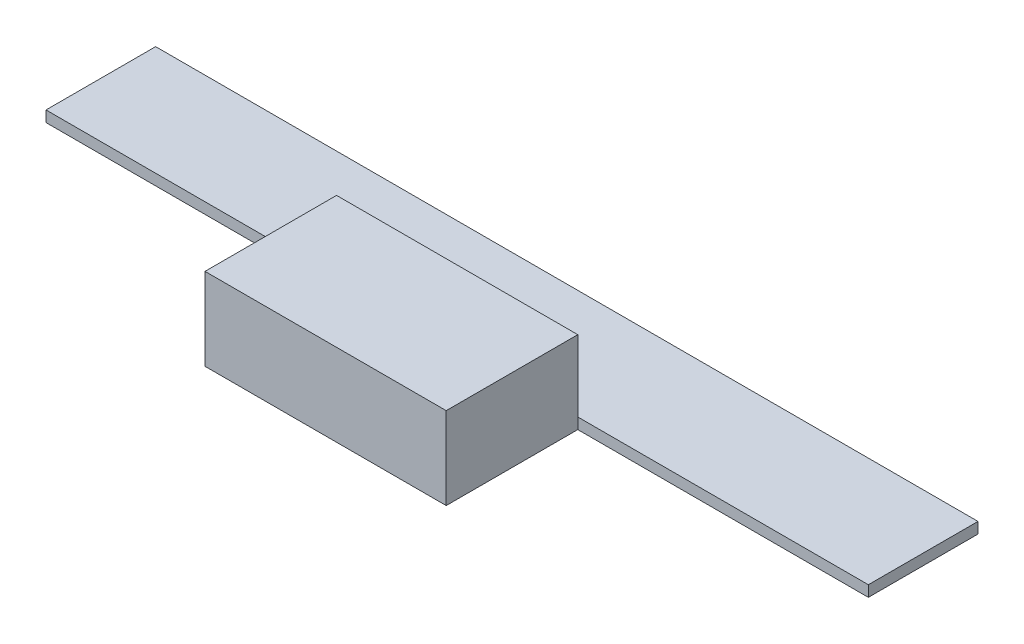
ISO-10303-21;
HEADER;
FILE_DESCRIPTION(('STEP AP214'),'2;1');
FILE_NAME('part.step','',(''),(''),'','','');
FILE_SCHEMA(('AUTOMOTIVE_DESIGN { 1 0 10303 214 1 1 1 1 }'));
ENDSEC;
DATA;
#1=APPLICATION_CONTEXT('core data for automotive mechanical design processes');
#2=APPLICATION_PROTOCOL_DEFINITION('international standard','automotive_design',2000,#1);
#3=PRODUCT_CONTEXT('',#1,'mechanical');
#4=PRODUCT('Part','Part','',(#3));
#5=PRODUCT_RELATED_PRODUCT_CATEGORY('part','',(#4));
#6=PRODUCT_DEFINITION_FORMATION('','',#4);
#7=PRODUCT_DEFINITION_CONTEXT('part definition',#1,'design');
#8=PRODUCT_DEFINITION('design','',#6,#7);
#9=PRODUCT_DEFINITION_SHAPE('','',#8);
#10=(LENGTH_UNIT() NAMED_UNIT(*) SI_UNIT(.MILLI.,.METRE.));
#11=(NAMED_UNIT(*) PLANE_ANGLE_UNIT() SI_UNIT($,.RADIAN.));
#12=(NAMED_UNIT(*) SI_UNIT($,.STERADIAN.) SOLID_ANGLE_UNIT());
#13=UNCERTAINTY_MEASURE_WITH_UNIT(LENGTH_MEASURE(1.E-05),#10,'distance_accuracy_value','');
#14=(GEOMETRIC_REPRESENTATION_CONTEXT(3) GLOBAL_UNCERTAINTY_ASSIGNED_CONTEXT((#13)) GLOBAL_UNIT_ASSIGNED_CONTEXT((#10,
#11,#12)) REPRESENTATION_CONTEXT('',''));
#15=CARTESIAN_POINT('',(0.,0.,0.));
#16=DIRECTION('',(0.,0.,1.));
#17=DIRECTION('',(1.,0.,0.));
#18=AXIS2_PLACEMENT_3D('',#15,#16,#17);
#19=CARTESIAN_POINT('',(-22.,15.,-12.));
#20=DIRECTION('',(0.,0.,1.));
#21=DIRECTION('',(1.,0.,0.));
#22=AXIS2_PLACEMENT_3D('',#19,#20,#21);
#23=PLANE('',#22);
#24=DIRECTION('',(1.,0.,0.));
#25=VECTOR('',#24,1.);
#26=CARTESIAN_POINT('',(75.,2.,-12.));
#27=LINE('',#26,#25);
#28=CARTESIAN_POINT('',(-22.,2.00000000000001,-12.));
#29=VERTEX_POINT('',#28);
#30=CARTESIAN_POINT('',(-10.,2.,-12.));
#31=VERTEX_POINT('',#30);
#32=EDGE_CURVE('E11',#29,#31,#27,.T.);
#33=ORIENTED_EDGE('',*,*,#32,.F.);
#34=DIRECTION('',(0.,-1.,0.));
#35=VECTOR('',#34,1.);
#36=CARTESIAN_POINT('',(-22.,15.,-12.));
#37=LINE('',#36,#35);
#38=CARTESIAN_POINT('',(-22.,15.,-12.));
#39=VERTEX_POINT('',#38);
#40=EDGE_CURVE('E309',#39,#29,#37,.T.);
#41=ORIENTED_EDGE('',*,*,#40,.F.);
#42=DIRECTION('',(-1.,0.,0.));
#43=VECTOR('',#42,1.);
#44=CARTESIAN_POINT('',(-22.,15.,-12.));
#45=LINE('',#44,#43);
#46=CARTESIAN_POINT('',(22.,15.,-12.));
#47=VERTEX_POINT('',#46);
#48=EDGE_CURVE('E283',#47,#39,#45,.T.);
#49=ORIENTED_EDGE('',*,*,#48,.F.);
#50=DIRECTION('',(0.,-1.,0.));
#51=VECTOR('',#50,1.);
#52=CARTESIAN_POINT('',(22.,15.,-12.));
#53=LINE('',#52,#51);
#54=CARTESIAN_POINT('',(22.,2.00000000000001,-12.));
#55=VERTEX_POINT('',#54);
#56=EDGE_CURVE('E313',#47,#55,#53,.T.);
#57=ORIENTED_EDGE('',*,*,#56,.T.);
#58=CARTESIAN_POINT('',(10.,2.,-12.));
#59=VERTEX_POINT('',#58);
#60=EDGE_CURVE('E55',#59,#55,#27,.T.);
#61=ORIENTED_EDGE('',*,*,#60,.F.);
#62=DIRECTION('',(0.,1.,0.));
#63=VECTOR('',#62,1.);
#64=CARTESIAN_POINT('',(10.,13.,-12.));
#65=LINE('',#64,#63);
#66=CARTESIAN_POINT('',(10.,13.,-12.));
#67=VERTEX_POINT('',#66);
#68=EDGE_CURVE('E203',#59,#67,#65,.T.);
#69=ORIENTED_EDGE('',*,*,#68,.T.);
#70=DIRECTION('',(-1.,0.,0.));
#71=VECTOR('',#70,1.);
#72=CARTESIAN_POINT('',(0.,13.,-12.));
#73=LINE('',#72,#71);
#74=CARTESIAN_POINT('',(-10.,13.,-12.));
#75=VERTEX_POINT('',#74);
#76=EDGE_CURVE('E256',#67,#75,#73,.T.);
#77=ORIENTED_EDGE('',*,*,#76,.T.);
#78=DIRECTION('',(0.,1.,0.));
#79=VECTOR('',#78,1.);
#80=CARTESIAN_POINT('',(-10.,13.,-12.));
#81=LINE('',#80,#79);
#82=EDGE_CURVE('E229',#31,#75,#81,.T.);
#83=ORIENTED_EDGE('',*,*,#82,.F.);
#84=EDGE_LOOP('',(#33,#41,#49,#57,#61,#69,#77,#83));
#85=FACE_BOUND('',#84,.T.);
#86=ADVANCED_FACE('F45',(#85),#23,.F.);
#87=CARTESIAN_POINT('',(-20.,15.,12.));
#88=DIRECTION('',(1.,0.,0.));
#89=DIRECTION('',(0.,0.,-1.));
#90=AXIS2_PLACEMENT_3D('',#87,#88,#89);
#91=PLANE('',#90);
#92=DIRECTION('',(0.,0.,1.));
#93=VECTOR('',#92,1.);
#94=CARTESIAN_POINT('',(-20.,2.,0.));
#95=LINE('',#94,#93);
#96=CARTESIAN_POINT('',(-20.,2.,-10.));
#97=VERTEX_POINT('',#96);
#98=CARTESIAN_POINT('',(-20.,2.,10.));
#99=VERTEX_POINT('',#98);
#100=EDGE_CURVE('E252',#97,#99,#95,.T.);
#101=ORIENTED_EDGE('',*,*,#100,.F.);
#102=DIRECTION('',(0.,-1.,0.));
#103=VECTOR('',#102,1.);
#104=CARTESIAN_POINT('',(-20.,13.,-10.));
#105=LINE('',#104,#103);
#106=CARTESIAN_POINT('',(-20.,13.,-10.));
#107=VERTEX_POINT('',#106);
#108=EDGE_CURVE('E228',#107,#97,#105,.T.);
#109=ORIENTED_EDGE('',*,*,#108,.F.);
#110=DIRECTION('',(0.,0.,1.));
#111=VECTOR('',#110,1.);
#112=CARTESIAN_POINT('',(-20.,13.,0.));
#113=LINE('',#112,#111);
#114=CARTESIAN_POINT('',(-20.,13.,10.));
#115=VERTEX_POINT('',#114);
#116=EDGE_CURVE('E268',#107,#115,#113,.T.);
#117=ORIENTED_EDGE('',*,*,#116,.T.);
#118=DIRECTION('',(0.,-1.,0.));
#119=VECTOR('',#118,1.);
#120=CARTESIAN_POINT('',(-20.,15.,10.));
#121=LINE('',#120,#119);
#122=EDGE_CURVE('E262',#115,#99,#121,.T.);
#123=ORIENTED_EDGE('',*,*,#122,.T.);
#124=EDGE_LOOP('',(#101,#109,#117,#123));
#125=FACE_BOUND('',#124,.T.);
#126=ADVANCED_FACE('F394',(#125),#91,.T.);
#127=CARTESIAN_POINT('',(0.,13.,0.));
#128=DIRECTION('',(0.,-1.,0.));
#129=DIRECTION('',(0.,0.,-1.));
#130=AXIS2_PLACEMENT_3D('',#127,#128,#129);
#131=PLANE('',#130);
#132=DIRECTION('',(1.,0.,0.));
#133=VECTOR('',#132,1.);
#134=CARTESIAN_POINT('',(10.,13.,-10.));
#135=LINE('',#134,#133);
#136=CARTESIAN_POINT('',(10.,13.,-10.));
#137=VERTEX_POINT('',#136);
#138=CARTESIAN_POINT('',(20.,13.,-10.));
#139=VERTEX_POINT('',#138);
#140=EDGE_CURVE('E217',#137,#139,#135,.T.);
#141=ORIENTED_EDGE('',*,*,#140,.T.);
#142=DIRECTION('',(0.,0.,-1.));
#143=VECTOR('',#142,1.);
#144=CARTESIAN_POINT('',(20.,13.,0.));
#145=LINE('',#144,#143);
#146=CARTESIAN_POINT('',(20.,13.,10.));
#147=VERTEX_POINT('',#146);
#148=EDGE_CURVE('E253',#147,#139,#145,.T.);
#149=ORIENTED_EDGE('',*,*,#148,.F.);
#150=DIRECTION('',(1.,0.,0.));
#151=VECTOR('',#150,1.);
#152=CARTESIAN_POINT('',(0.,13.,10.));
#153=LINE('',#152,#151);
#154=EDGE_CURVE('E263',#115,#147,#153,.T.);
#155=ORIENTED_EDGE('',*,*,#154,.F.);
#156=ORIENTED_EDGE('',*,*,#116,.F.);
#157=DIRECTION('',(-1.,0.,0.));
#158=VECTOR('',#157,1.);
#159=CARTESIAN_POINT('',(-10.,13.,-10.));
#160=LINE('',#159,#158);
#161=CARTESIAN_POINT('',(-10.,13.,-10.));
#162=VERTEX_POINT('',#161);
#163=EDGE_CURVE('E241',#162,#107,#160,.T.);
#164=ORIENTED_EDGE('',*,*,#163,.F.);
#165=DIRECTION('',(0.,0.,1.));
#166=VECTOR('',#165,1.);
#167=CARTESIAN_POINT('',(-10.,13.,-12.));
#168=LINE('',#167,#166);
#169=EDGE_CURVE('E233',#75,#162,#168,.T.);
#170=ORIENTED_EDGE('',*,*,#169,.F.);
#171=ORIENTED_EDGE('',*,*,#76,.F.);
#172=DIRECTION('',(0.,0.,1.));
#173=VECTOR('',#172,1.);
#174=CARTESIAN_POINT('',(10.,13.,-12.));
#175=LINE('',#174,#173);
#176=EDGE_CURVE('E70',#67,#137,#175,.T.);
#177=ORIENTED_EDGE('',*,*,#176,.T.);
#178=EDGE_LOOP('',(#141,#149,#155,#156,#164,#170,#171,#177));
#179=FACE_BOUND('',#178,.T.);
#180=ADVANCED_FACE('F399',(#179),#131,.T.);
#181=CARTESIAN_POINT('',(0.,2.,0.));
#182=DIRECTION('',(0.,-1.,0.));
#183=DIRECTION('',(0.,0.,-1.));
#184=AXIS2_PLACEMENT_3D('',#181,#182,#183);
#185=PLANE('',#184);
#186=DIRECTION('',(0.,0.,-1.));
#187=VECTOR('',#186,1.);
#188=CARTESIAN_POINT('',(20.,2.,0.));
#189=LINE('',#188,#187);
#190=CARTESIAN_POINT('',(20.,2.,10.));
#191=VERTEX_POINT('',#190);
#192=CARTESIAN_POINT('',(20.,2.,-10.));
#193=VERTEX_POINT('',#192);
#194=EDGE_CURVE('E248',#191,#193,#189,.T.);
#195=ORIENTED_EDGE('',*,*,#194,.T.);
#196=DIRECTION('',(-1.,0.,0.));
#197=VECTOR('',#196,1.);
#198=CARTESIAN_POINT('',(0.,2.,-10.));
#199=LINE('',#198,#197);
#200=CARTESIAN_POINT('',(10.,2.,-10.));
#201=VERTEX_POINT('',#200);
#202=EDGE_CURVE('E221',#193,#201,#199,.T.);
#203=ORIENTED_EDGE('',*,*,#202,.T.);
#204=DIRECTION('',(0.,0.,1.));
#205=VECTOR('',#204,1.);
#206=CARTESIAN_POINT('',(10.,2.,0.));
#207=LINE('',#206,#205);
#208=EDGE_CURVE('E224',#59,#201,#207,.T.);
#209=ORIENTED_EDGE('',*,*,#208,.F.);
#210=ORIENTED_EDGE('',*,*,#60,.T.);
#211=CARTESIAN_POINT('',(75.,2.,-12.));
#212=VERTEX_POINT('',#211);
#213=EDGE_CURVE('E57',#55,#212,#27,.T.);
#214=ORIENTED_EDGE('',*,*,#213,.T.);
#215=DIRECTION('',(0.,0.,1.));
#216=VECTOR('',#215,1.);
#217=CARTESIAN_POINT('',(75.,2.,-32.));
#218=LINE('',#217,#216);
#219=CARTESIAN_POINT('',(75.,2.,-32.));
#220=VERTEX_POINT('',#219);
#221=EDGE_CURVE('E348',#220,#212,#218,.T.);
#222=ORIENTED_EDGE('',*,*,#221,.F.);
#223=DIRECTION('',(1.,0.,0.));
#224=VECTOR('',#223,1.);
#225=CARTESIAN_POINT('',(75.,2.,-32.));
#226=LINE('',#225,#224);
#227=CARTESIAN_POINT('',(-75.,2.00000000000003,-32.));
#228=VERTEX_POINT('',#227);
#229=EDGE_CURVE('E188',#228,#220,#226,.T.);
#230=ORIENTED_EDGE('',*,*,#229,.F.);
#231=DIRECTION('',(0.,0.,1.));
#232=VECTOR('',#231,1.);
#233=CARTESIAN_POINT('',(-75.,2.00000000000003,-32.));
#234=LINE('',#233,#232);
#235=CARTESIAN_POINT('',(-75.,2.00000000000003,-12.));
#236=VERTEX_POINT('',#235);
#237=EDGE_CURVE('E205',#228,#236,#234,.T.);
#238=ORIENTED_EDGE('',*,*,#237,.T.);
#239=EDGE_CURVE('E193',#236,#29,#27,.T.);
#240=ORIENTED_EDGE('',*,*,#239,.T.);
#241=ORIENTED_EDGE('',*,*,#32,.T.);
#242=DIRECTION('',(0.,0.,-1.));
#243=VECTOR('',#242,1.);
#244=CARTESIAN_POINT('',(-10.,2.,0.));
#245=LINE('',#244,#243);
#246=CARTESIAN_POINT('',(-10.,2.,-10.));
#247=VERTEX_POINT('',#246);
#248=EDGE_CURVE('E315',#247,#31,#245,.T.);
#249=ORIENTED_EDGE('',*,*,#248,.F.);
#250=DIRECTION('',(1.,0.,0.));
#251=VECTOR('',#250,1.);
#252=CARTESIAN_POINT('',(0.,2.,-10.));
#253=LINE('',#252,#251);
#254=EDGE_CURVE('E49',#97,#247,#253,.T.);
#255=ORIENTED_EDGE('',*,*,#254,.F.);
#256=ORIENTED_EDGE('',*,*,#100,.T.);
#257=DIRECTION('',(1.,0.,0.));
#258=VECTOR('',#257,1.);
#259=CARTESIAN_POINT('',(0.,2.,10.));
#260=LINE('',#259,#258);
#261=EDGE_CURVE('E257',#99,#191,#260,.T.);
#262=ORIENTED_EDGE('',*,*,#261,.T.);
#263=EDGE_LOOP('',(#195,#203,#209,#210,#214,#222,#230,#238,#240,#241,#249,#255,#256,#262));
#264=FACE_BOUND('',#263,.T.);
#265=ADVANCED_FACE('F352',(#264),#185,.F.);
#266=CARTESIAN_POINT('',(22.,15.,12.));
#267=DIRECTION('',(-1.,0.,0.));
#268=DIRECTION('',(0.,0.,1.));
#269=AXIS2_PLACEMENT_3D('',#266,#267,#268);
#270=PLANE('',#269);
#271=DIRECTION('',(0.,0.,-1.));
#272=VECTOR('',#271,1.);
#273=CARTESIAN_POINT('',(22.,0.,12.));
#274=LINE('',#273,#272);
#275=CARTESIAN_POINT('',(22.,0.,12.));
#276=VERTEX_POINT('',#275);
#277=CARTESIAN_POINT('',(22.,0.,-12.));
#278=VERTEX_POINT('',#277);
#279=EDGE_CURVE('E272',#276,#278,#274,.T.);
#280=ORIENTED_EDGE('',*,*,#279,.T.);
#281=EDGE_CURVE('E312',#55,#278,#53,.T.);
#282=ORIENTED_EDGE('',*,*,#281,.F.);
#283=ORIENTED_EDGE('',*,*,#56,.F.);
#284=DIRECTION('',(0.,0.,-1.));
#285=VECTOR('',#284,1.);
#286=CARTESIAN_POINT('',(22.,15.,12.));
#287=LINE('',#286,#285);
#288=CARTESIAN_POINT('',(22.,15.,12.));
#289=VERTEX_POINT('',#288);
#290=EDGE_CURVE('E279',#289,#47,#287,.T.);
#291=ORIENTED_EDGE('',*,*,#290,.F.);
#292=DIRECTION('',(0.,-1.,0.));
#293=VECTOR('',#292,1.);
#294=CARTESIAN_POINT('',(22.,15.,12.));
#295=LINE('',#294,#293);
#296=EDGE_CURVE('E293',#289,#276,#295,.T.);
#297=ORIENTED_EDGE('',*,*,#296,.T.);
#298=EDGE_LOOP('',(#280,#282,#283,#291,#297));
#299=FACE_BOUND('',#298,.T.);
#300=ADVANCED_FACE('F47',(#299),#270,.F.);
#301=CARTESIAN_POINT('',(-22.,15.,12.));
#302=DIRECTION('',(1.,0.,0.));
#303=DIRECTION('',(0.,0.,-1.));
#304=AXIS2_PLACEMENT_3D('',#301,#302,#303);
#305=PLANE('',#304);
#306=DIRECTION('',(0.,0.,1.));
#307=VECTOR('',#306,1.);
#308=CARTESIAN_POINT('',(-22.,0.,12.));
#309=LINE('',#308,#307);
#310=CARTESIAN_POINT('',(-22.,0.,-12.));
#311=VERTEX_POINT('',#310);
#312=CARTESIAN_POINT('',(-22.,0.,12.));
#313=VERTEX_POINT('',#312);
#314=EDGE_CURVE('E296',#311,#313,#309,.T.);
#315=ORIENTED_EDGE('',*,*,#314,.T.);
#316=DIRECTION('',(0.,-1.,0.));
#317=VECTOR('',#316,1.);
#318=CARTESIAN_POINT('',(-22.,15.,12.));
#319=LINE('',#318,#317);
#320=CARTESIAN_POINT('',(-22.,15.,12.));
#321=VERTEX_POINT('',#320);
#322=EDGE_CURVE('E304',#321,#313,#319,.T.);
#323=ORIENTED_EDGE('',*,*,#322,.F.);
#324=DIRECTION('',(0.,0.,1.));
#325=VECTOR('',#324,1.);
#326=CARTESIAN_POINT('',(-22.,15.,12.));
#327=LINE('',#326,#325);
#328=EDGE_CURVE('E287',#39,#321,#327,.T.);
#329=ORIENTED_EDGE('',*,*,#328,.F.);
#330=ORIENTED_EDGE('',*,*,#40,.T.);
#331=EDGE_CURVE('E308',#29,#311,#37,.T.);
#332=ORIENTED_EDGE('',*,*,#331,.T.);
#333=EDGE_LOOP('',(#315,#323,#329,#330,#332));
#334=FACE_BOUND('',#333,.T.);
#335=ADVANCED_FACE('F370',(#334),#305,.F.);
#336=CARTESIAN_POINT('',(-22.,15.,12.));
#337=DIRECTION('',(0.,0.,-1.));
#338=DIRECTION('',(-1.,0.,0.));
#339=AXIS2_PLACEMENT_3D('',#336,#337,#338);
#340=PLANE('',#339);
#341=DIRECTION('',(1.,0.,0.));
#342=VECTOR('',#341,1.);
#343=CARTESIAN_POINT('',(-22.,0.,12.));
#344=LINE('',#343,#342);
#345=EDGE_CURVE('E284',#313,#276,#344,.T.);
#346=ORIENTED_EDGE('',*,*,#345,.T.);
#347=ORIENTED_EDGE('',*,*,#296,.F.);
#348=DIRECTION('',(1.,0.,0.));
#349=VECTOR('',#348,1.);
#350=CARTESIAN_POINT('',(-22.,15.,12.));
#351=LINE('',#350,#349);
#352=EDGE_CURVE('E290',#321,#289,#351,.T.);
#353=ORIENTED_EDGE('',*,*,#352,.F.);
#354=ORIENTED_EDGE('',*,*,#322,.T.);
#355=EDGE_LOOP('',(#346,#347,#353,#354));
#356=FACE_BOUND('',#355,.T.);
#357=ADVANCED_FACE('F366',(#356),#340,.F.);
#358=CARTESIAN_POINT('',(0.,15.,0.));
#359=DIRECTION('',(0.,-1.,0.));
#360=DIRECTION('',(0.,0.,-1.));
#361=AXIS2_PLACEMENT_3D('',#358,#359,#360);
#362=PLANE('',#361);
#363=ORIENTED_EDGE('',*,*,#290,.T.);
#364=ORIENTED_EDGE('',*,*,#48,.T.);
#365=ORIENTED_EDGE('',*,*,#328,.T.);
#366=ORIENTED_EDGE('',*,*,#352,.T.);
#367=EDGE_LOOP('',(#363,#364,#365,#366));
#368=FACE_BOUND('',#367,.T.);
#369=ADVANCED_FACE('F407',(#368),#362,.F.);
#370=CARTESIAN_POINT('',(0.,0.,0.));
#371=DIRECTION('',(0.,-1.,0.));
#372=DIRECTION('',(0.,0.,-1.));
#373=AXIS2_PLACEMENT_3D('',#370,#371,#372);
#374=PLANE('',#373);
#375=ORIENTED_EDGE('',*,*,#279,.F.);
#376=ORIENTED_EDGE('',*,*,#345,.F.);
#377=ORIENTED_EDGE('',*,*,#314,.F.);
#378=DIRECTION('',(-1.,0.,0.));
#379=VECTOR('',#378,1.);
#380=CARTESIAN_POINT('',(75.,0.,-12.));
#381=LINE('',#380,#379);
#382=CARTESIAN_POINT('',(-75.,0.,-12.));
#383=VERTEX_POINT('',#382);
#384=EDGE_CURVE('E341',#311,#383,#381,.T.);
#385=ORIENTED_EDGE('',*,*,#384,.T.);
#386=DIRECTION('',(0.,0.,1.));
#387=VECTOR('',#386,1.);
#388=CARTESIAN_POINT('',(-75.,0.,-32.));
#389=LINE('',#388,#387);
#390=CARTESIAN_POINT('',(-75.,0.,-32.));
#391=VERTEX_POINT('',#390);
#392=EDGE_CURVE('E178',#391,#383,#389,.T.);
#393=ORIENTED_EDGE('',*,*,#392,.F.);
#394=DIRECTION('',(-1.,0.,0.));
#395=VECTOR('',#394,1.);
#396=CARTESIAN_POINT('',(75.,0.,-32.));
#397=LINE('',#396,#395);
#398=CARTESIAN_POINT('',(75.,0.,-32.));
#399=VERTEX_POINT('',#398);
#400=EDGE_CURVE('E169',#399,#391,#397,.T.);
#401=ORIENTED_EDGE('',*,*,#400,.F.);
#402=DIRECTION('',(0.,0.,1.));
#403=VECTOR('',#402,1.);
#404=CARTESIAN_POINT('',(75.,0.,-32.));
#405=LINE('',#404,#403);
#406=CARTESIAN_POINT('',(75.,0.,-12.));
#407=VERTEX_POINT('',#406);
#408=EDGE_CURVE('E175',#399,#407,#405,.T.);
#409=ORIENTED_EDGE('',*,*,#408,.T.);
#410=EDGE_CURVE('E336',#407,#278,#381,.T.);
#411=ORIENTED_EDGE('',*,*,#410,.T.);
#412=EDGE_LOOP('',(#375,#376,#377,#385,#393,#401,#409,#411));
#413=FACE_BOUND('',#412,.T.);
#414=ADVANCED_FACE('F172',(#413),#374,.T.);
#415=CARTESIAN_POINT('',(20.,15.,12.));
#416=DIRECTION('',(-1.,0.,0.));
#417=DIRECTION('',(0.,0.,1.));
#418=AXIS2_PLACEMENT_3D('',#415,#416,#417);
#419=PLANE('',#418);
#420=DIRECTION('',(0.,-1.,0.));
#421=VECTOR('',#420,1.);
#422=CARTESIAN_POINT('',(20.,13.,-10.));
#423=LINE('',#422,#421);
#424=EDGE_CURVE('E199',#139,#193,#423,.T.);
#425=ORIENTED_EDGE('',*,*,#424,.T.);
#426=ORIENTED_EDGE('',*,*,#194,.F.);
#427=DIRECTION('',(0.,-1.,0.));
#428=VECTOR('',#427,1.);
#429=CARTESIAN_POINT('',(20.,15.,10.));
#430=LINE('',#429,#428);
#431=EDGE_CURVE('E258',#147,#191,#430,.T.);
#432=ORIENTED_EDGE('',*,*,#431,.F.);
#433=ORIENTED_EDGE('',*,*,#148,.T.);
#434=EDGE_LOOP('',(#425,#426,#432,#433));
#435=FACE_BOUND('',#434,.T.);
#436=ADVANCED_FACE('F410',(#435),#419,.T.);
#437=CARTESIAN_POINT('',(-22.,15.,10.));
#438=DIRECTION('',(0.,0.,-1.));
#439=DIRECTION('',(-1.,0.,0.));
#440=AXIS2_PLACEMENT_3D('',#437,#438,#439);
#441=PLANE('',#440);
#442=ORIENTED_EDGE('',*,*,#261,.F.);
#443=ORIENTED_EDGE('',*,*,#122,.F.);
#444=ORIENTED_EDGE('',*,*,#154,.T.);
#445=ORIENTED_EDGE('',*,*,#431,.T.);
#446=EDGE_LOOP('',(#442,#443,#444,#445));
#447=FACE_BOUND('',#446,.T.);
#448=ADVANCED_FACE('F417',(#447),#441,.T.);
#449=CARTESIAN_POINT('',(-10.,13.,-10.));
#450=DIRECTION('',(0.,0.,-1.));
#451=DIRECTION('',(0.,1.,0.));
#452=AXIS2_PLACEMENT_3D('',#449,#450,#451);
#453=PLANE('',#452);
#454=ORIENTED_EDGE('',*,*,#108,.T.);
#455=ORIENTED_EDGE('',*,*,#254,.T.);
#456=DIRECTION('',(0.,-1.,0.));
#457=VECTOR('',#456,1.);
#458=CARTESIAN_POINT('',(-10.,13.,-10.));
#459=LINE('',#458,#457);
#460=EDGE_CURVE('E237',#162,#247,#459,.T.);
#461=ORIENTED_EDGE('',*,*,#460,.F.);
#462=ORIENTED_EDGE('',*,*,#163,.T.);
#463=EDGE_LOOP('',(#454,#455,#461,#462));
#464=FACE_BOUND('',#463,.T.);
#465=ADVANCED_FACE('F419',(#464),#453,.F.);
#466=CARTESIAN_POINT('',(-10.,0.,0.));
#467=DIRECTION('',(-1.,0.,0.));
#468=DIRECTION('',(0.,0.,1.));
#469=AXIS2_PLACEMENT_3D('',#466,#467,#468);
#470=PLANE('',#469);
#471=ORIENTED_EDGE('',*,*,#460,.T.);
#472=ORIENTED_EDGE('',*,*,#248,.T.);
#473=ORIENTED_EDGE('',*,*,#82,.T.);
#474=ORIENTED_EDGE('',*,*,#169,.T.);
#475=EDGE_LOOP('',(#471,#472,#473,#474));
#476=FACE_BOUND('',#475,.T.);
#477=ADVANCED_FACE('F427',(#476),#470,.F.);
#478=CARTESIAN_POINT('',(10.,0.,0.));
#479=DIRECTION('',(1.,0.,0.));
#480=DIRECTION('',(0.,0.,1.));
#481=AXIS2_PLACEMENT_3D('',#478,#479,#480);
#482=PLANE('',#481);
#483=ORIENTED_EDGE('',*,*,#68,.F.);
#484=ORIENTED_EDGE('',*,*,#208,.T.);
#485=DIRECTION('',(0.,-1.,0.));
#486=VECTOR('',#485,1.);
#487=CARTESIAN_POINT('',(10.,13.,-10.));
#488=LINE('',#487,#486);
#489=EDGE_CURVE('E212',#137,#201,#488,.T.);
#490=ORIENTED_EDGE('',*,*,#489,.F.);
#491=ORIENTED_EDGE('',*,*,#176,.F.);
#492=EDGE_LOOP('',(#483,#484,#490,#491));
#493=FACE_BOUND('',#492,.T.);
#494=ADVANCED_FACE('F387',(#493),#482,.F.);
#495=CARTESIAN_POINT('',(10.,13.,-10.));
#496=DIRECTION('',(0.,0.,1.));
#497=DIRECTION('',(0.,-1.,0.));
#498=AXIS2_PLACEMENT_3D('',#495,#496,#497);
#499=PLANE('',#498);
#500=ORIENTED_EDGE('',*,*,#202,.F.);
#501=ORIENTED_EDGE('',*,*,#424,.F.);
#502=ORIENTED_EDGE('',*,*,#140,.F.);
#503=ORIENTED_EDGE('',*,*,#489,.T.);
#504=EDGE_LOOP('',(#500,#501,#502,#503));
#505=FACE_BOUND('',#504,.T.);
#506=ADVANCED_FACE('F379',(#505),#499,.T.);
#507=CARTESIAN_POINT('',(0.,0.,-12.));
#508=DIRECTION('',(0.,0.,1.));
#509=DIRECTION('',(1.,0.,0.));
#510=AXIS2_PLACEMENT_3D('',#507,#508,#509);
#511=PLANE('',#510);
#512=ORIENTED_EDGE('',*,*,#331,.F.);
#513=ORIENTED_EDGE('',*,*,#239,.F.);
#514=DIRECTION('',(0.,1.,0.));
#515=VECTOR('',#514,1.);
#516=CARTESIAN_POINT('',(-75.,0.,-12.));
#517=LINE('',#516,#515);
#518=EDGE_CURVE('E333',#383,#236,#517,.T.);
#519=ORIENTED_EDGE('',*,*,#518,.F.);
#520=ORIENTED_EDGE('',*,*,#384,.F.);
#521=EDGE_LOOP('',(#512,#513,#519,#520));
#522=FACE_BOUND('',#521,.T.);
#523=ADVANCED_FACE('F374',(#522),#511,.T.);
#524=CARTESIAN_POINT('',(75.,0.,-32.));
#525=DIRECTION('',(-1.,0.,0.));
#526=DIRECTION('',(0.,0.,1.));
#527=AXIS2_PLACEMENT_3D('',#524,#525,#526);
#528=PLANE('',#527);
#529=DIRECTION('',(0.,-1.,0.));
#530=VECTOR('',#529,1.);
#531=CARTESIAN_POINT('',(75.,0.,-12.));
#532=LINE('',#531,#530);
#533=EDGE_CURVE('E197',#212,#407,#532,.T.);
#534=ORIENTED_EDGE('',*,*,#533,.T.);
#535=ORIENTED_EDGE('',*,*,#408,.F.);
#536=DIRECTION('',(0.,-1.,0.));
#537=VECTOR('',#536,1.);
#538=CARTESIAN_POINT('',(75.,0.,-32.));
#539=LINE('',#538,#537);
#540=EDGE_CURVE('E183',#220,#399,#539,.T.);
#541=ORIENTED_EDGE('',*,*,#540,.F.);
#542=ORIENTED_EDGE('',*,*,#221,.T.);
#543=EDGE_LOOP('',(#534,#535,#541,#542));
#544=FACE_BOUND('',#543,.T.);
#545=ADVANCED_FACE('F195',(#544),#528,.F.);
#546=CARTESIAN_POINT('',(-75.,0.,-32.));
#547=DIRECTION('',(1.,0.,0.));
#548=DIRECTION('',(0.,0.,-1.));
#549=AXIS2_PLACEMENT_3D('',#546,#547,#548);
#550=PLANE('',#549);
#551=ORIENTED_EDGE('',*,*,#518,.T.);
#552=ORIENTED_EDGE('',*,*,#237,.F.);
#553=DIRECTION('',(0.,1.,0.));
#554=VECTOR('',#553,1.);
#555=CARTESIAN_POINT('',(-75.,0.,-32.));
#556=LINE('',#555,#554);
#557=EDGE_CURVE('E182',#391,#228,#556,.T.);
#558=ORIENTED_EDGE('',*,*,#557,.F.);
#559=ORIENTED_EDGE('',*,*,#392,.T.);
#560=EDGE_LOOP('',(#551,#552,#558,#559));
#561=FACE_BOUND('',#560,.T.);
#562=ADVANCED_FACE('F350',(#561),#550,.F.);
#563=CARTESIAN_POINT('',(0.,0.,-32.));
#564=DIRECTION('',(0.,0.,1.));
#565=DIRECTION('',(1.,0.,0.));
#566=AXIS2_PLACEMENT_3D('',#563,#564,#565);
#567=PLANE('',#566);
#568=ORIENTED_EDGE('',*,*,#540,.T.);
#569=ORIENTED_EDGE('',*,*,#400,.T.);
#570=ORIENTED_EDGE('',*,*,#557,.T.);
#571=ORIENTED_EDGE('',*,*,#229,.T.);
#572=EDGE_LOOP('',(#568,#569,#570,#571));
#573=FACE_BOUND('',#572,.T.);
#574=ADVANCED_FACE('F186',(#573),#567,.F.);
#575=ORIENTED_EDGE('',*,*,#213,.F.);
#576=ORIENTED_EDGE('',*,*,#281,.T.);
#577=ORIENTED_EDGE('',*,*,#410,.F.);
#578=ORIENTED_EDGE('',*,*,#533,.F.);
#579=EDGE_LOOP('',(#575,#576,#577,#578));
#580=FACE_BOUND('',#579,.T.);
#581=ADVANCED_FACE('F355',(#580),#511,.T.);
#582=CLOSED_SHELL('',(#86,#126,#180,#265,#300,#335,#357,#369,#414,#436,#448,#465,#477,#494,#506,
#523,#545,#562,#574,#581));
#583=MANIFOLD_SOLID_BREP('B2',#582);
#584=ADVANCED_BREP_SHAPE_REPRESENTATION('',(#18,#583),#14);
#585=SHAPE_DEFINITION_REPRESENTATION(#9,#584);
ENDSEC;
END-ISO-10303-21;
